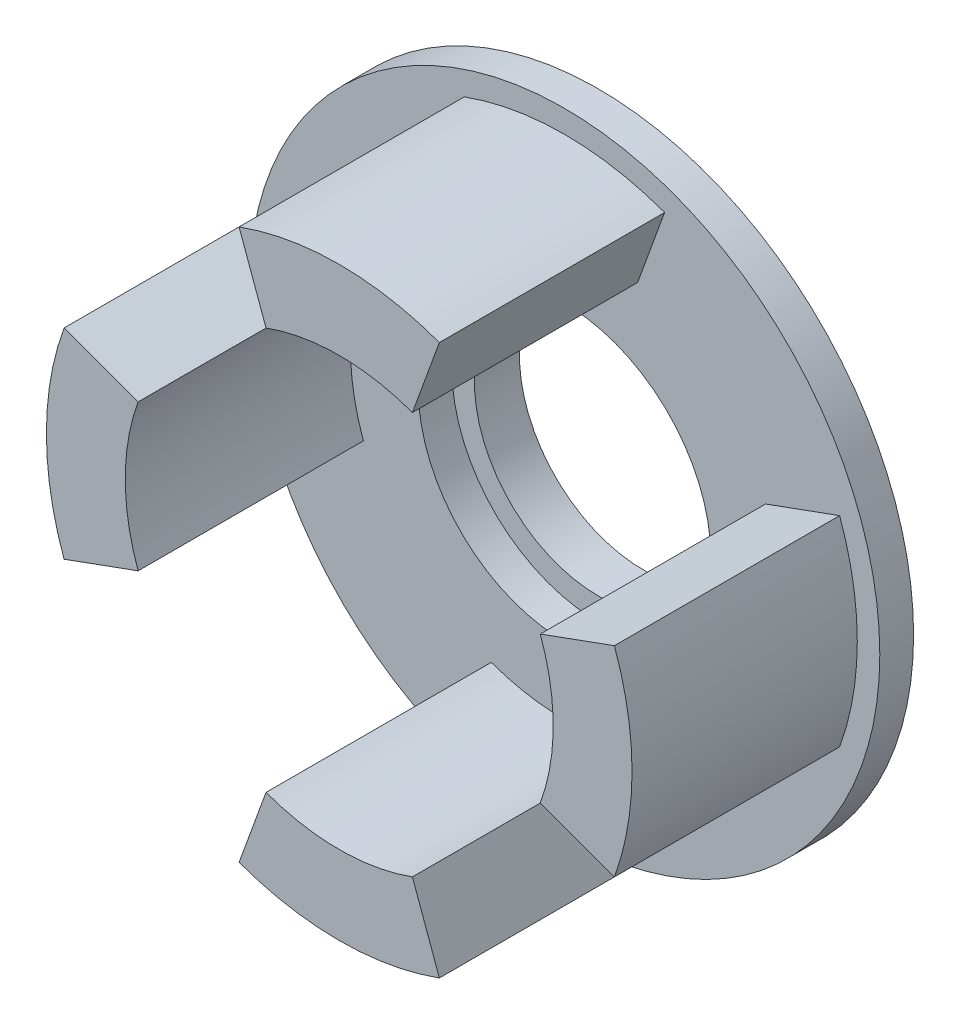
ISO-10303-21;
HEADER;
FILE_DESCRIPTION(('STEP AP214'),'2;1');
FILE_NAME('part.step','',(''),(''),'','','');
FILE_SCHEMA(('AUTOMOTIVE_DESIGN { 1 0 10303 214 1 1 1 1 }'));
ENDSEC;
DATA;
#1=APPLICATION_CONTEXT('core data for automotive mechanical design processes');
#2=APPLICATION_PROTOCOL_DEFINITION('international standard','automotive_design',2000,#1);
#3=PRODUCT_CONTEXT('',#1,'mechanical');
#4=PRODUCT('Part','Part','',(#3));
#5=PRODUCT_RELATED_PRODUCT_CATEGORY('part','',(#4));
#6=PRODUCT_DEFINITION_FORMATION('','',#4);
#7=PRODUCT_DEFINITION_CONTEXT('part definition',#1,'design');
#8=PRODUCT_DEFINITION('design','',#6,#7);
#9=PRODUCT_DEFINITION_SHAPE('','',#8);
#10=(LENGTH_UNIT() NAMED_UNIT(*) SI_UNIT(.MILLI.,.METRE.));
#11=(NAMED_UNIT(*) PLANE_ANGLE_UNIT() SI_UNIT($,.RADIAN.));
#12=(NAMED_UNIT(*) SI_UNIT($,.STERADIAN.) SOLID_ANGLE_UNIT());
#13=UNCERTAINTY_MEASURE_WITH_UNIT(LENGTH_MEASURE(1.E-05),#10,'distance_accuracy_value','');
#14=(GEOMETRIC_REPRESENTATION_CONTEXT(3) GLOBAL_UNCERTAINTY_ASSIGNED_CONTEXT((#13)) GLOBAL_UNIT_ASSIGNED_CONTEXT((#10,
#11,#12)) REPRESENTATION_CONTEXT('',''));
#15=CARTESIAN_POINT('',(0.,0.,0.));
#16=DIRECTION('',(0.,0.,1.));
#17=DIRECTION('',(1.,0.,0.));
#18=AXIS2_PLACEMENT_3D('',#15,#16,#17);
#19=CARTESIAN_POINT('',(0.,0.,7.));
#20=DIRECTION('',(0.,0.,1.));
#21=DIRECTION('',(1.,0.,0.));
#22=AXIS2_PLACEMENT_3D('',#19,#20,#21);
#23=PLANE('',#22);
#24=CARTESIAN_POINT('',(0.,0.,7.));
#25=DIRECTION('',(0.,0.,1.));
#26=DIRECTION('',(1.,0.,0.));
#27=AXIS2_PLACEMENT_3D('',#24,#25,#26);
#28=CIRCLE('',#27,28.);
#29=CARTESIAN_POINT('',(28.,0.,7.));
#30=VERTEX_POINT('',#29);
#31=EDGE_CURVE('E317',#30,#30,#28,.T.);
#32=ORIENTED_EDGE('',*,*,#31,.T.);
#33=EDGE_LOOP('',(#32));
#34=FACE_BOUND('',#33,.T.);
#35=CARTESIAN_POINT('',(0.,0.,7.));
#36=DIRECTION('',(0.,0.,1.));
#37=DIRECTION('',(1.,0.,0.));
#38=AXIS2_PLACEMENT_3D('',#35,#36,#37);
#39=CIRCLE('',#38,13.);
#40=CARTESIAN_POINT('',(13.,0.,7.));
#41=VERTEX_POINT('',#40);
#42=EDGE_CURVE('E309',#41,#41,#39,.T.);
#43=ORIENTED_EDGE('',*,*,#42,.F.);
#44=EDGE_LOOP('',(#43));
#45=FACE_BOUND('',#44,.T.);
#46=DIRECTION('',(0.34202014332567,-0.939692620785908,0.));
#47=VECTOR('',#46,1.);
#48=CARTESIAN_POINT('',(-8.89252372646741,24.4320081404336,7.));
#49=LINE('',#48,#47);
#50=CARTESIAN_POINT('',(-8.89252372646741,24.4320081404336,7.));
#51=VERTEX_POINT('',#50);
#52=CARTESIAN_POINT('',(-6.49838272318772,17.8541597949323,7.));
#53=VERTEX_POINT('',#52);
#54=EDGE_CURVE('E286',#51,#53,#49,.T.);
#55=ORIENTED_EDGE('',*,*,#54,.F.);
#56=CARTESIAN_POINT('',(0.,0.,7.));
#57=DIRECTION('',(0.,0.,1.));
#58=DIRECTION('',(1.,0.,0.));
#59=AXIS2_PLACEMENT_3D('',#56,#57,#58);
#60=CIRCLE('',#59,26.);
#61=CARTESIAN_POINT('',(8.89252372646741,24.4320081404336,7.));
#62=VERTEX_POINT('',#61);
#63=EDGE_CURVE('E267',#62,#51,#60,.T.);
#64=ORIENTED_EDGE('',*,*,#63,.F.);
#65=DIRECTION('',(0.342020143325669,0.939692620785908,0.));
#66=VECTOR('',#65,1.);
#67=CARTESIAN_POINT('',(8.89252372646741,24.4320081404336,7.));
#68=LINE('',#67,#66);
#69=CARTESIAN_POINT('',(6.49838272318772,17.8541597949323,7.));
#70=VERTEX_POINT('',#69);
#71=EDGE_CURVE('E273',#70,#62,#68,.T.);
#72=ORIENTED_EDGE('',*,*,#71,.F.);
#73=CARTESIAN_POINT('',(0.,0.,7.));
#74=DIRECTION('',(0.,0.,-1.));
#75=DIRECTION('',(1.,0.,0.));
#76=AXIS2_PLACEMENT_3D('',#73,#74,#75);
#77=CIRCLE('',#76,19.);
#78=EDGE_CURVE('E289',#53,#70,#77,.T.);
#79=ORIENTED_EDGE('',*,*,#78,.F.);
#80=EDGE_LOOP('',(#55,#64,#72,#79));
#81=FACE_BOUND('',#80,.T.);
#82=DIRECTION('',(-0.939692620785909,-0.342020143325667,0.));
#83=VECTOR('',#82,1.);
#84=CARTESIAN_POINT('',(24.4320081404336,8.89252372646732,7.));
#85=LINE('',#84,#83);
#86=CARTESIAN_POINT('',(24.4320081404336,8.89252372646732,7.));
#87=VERTEX_POINT('',#86);
#88=CARTESIAN_POINT('',(17.8541597949323,6.49838272318766,7.));
#89=VERTEX_POINT('',#88);
#90=EDGE_CURVE('E245',#87,#89,#85,.T.);
#91=ORIENTED_EDGE('',*,*,#90,.F.);
#92=CARTESIAN_POINT('',(0.,0.,7.));
#93=DIRECTION('',(0.,0.,1.));
#94=DIRECTION('',(1.,0.,0.));
#95=AXIS2_PLACEMENT_3D('',#92,#93,#94);
#96=CIRCLE('',#95,26.);
#97=CARTESIAN_POINT('',(24.4320081404336,-8.89252372646749,7.));
#98=VERTEX_POINT('',#97);
#99=EDGE_CURVE('E226',#98,#87,#96,.T.);
#100=ORIENTED_EDGE('',*,*,#99,.F.);
#101=DIRECTION('',(0.939692620785907,-0.342020143325672,0.));
#102=VECTOR('',#101,1.);
#103=CARTESIAN_POINT('',(24.4320081404336,-8.89252372646749,7.));
#104=LINE('',#103,#102);
#105=CARTESIAN_POINT('',(17.8541597949322,-6.49838272318778,7.));
#106=VERTEX_POINT('',#105);
#107=EDGE_CURVE('E232',#106,#98,#104,.T.);
#108=ORIENTED_EDGE('',*,*,#107,.F.);
#109=CARTESIAN_POINT('',(0.,0.,7.));
#110=DIRECTION('',(0.,0.,-1.));
#111=DIRECTION('',(1.,0.,0.));
#112=AXIS2_PLACEMENT_3D('',#109,#110,#111);
#113=CIRCLE('',#112,19.);
#114=EDGE_CURVE('E248',#89,#106,#113,.T.);
#115=ORIENTED_EDGE('',*,*,#114,.F.);
#116=EDGE_LOOP('',(#91,#100,#108,#115));
#117=FACE_BOUND('',#116,.T.);
#118=DIRECTION('',(-0.342020143325663,0.939692620785911,0.));
#119=VECTOR('',#118,1.);
#120=CARTESIAN_POINT('',(8.89252372646724,-24.4320081404337,7.));
#121=LINE('',#120,#119);
#122=CARTESIAN_POINT('',(8.89252372646724,-24.4320081404337,7.));
#123=VERTEX_POINT('',#122);
#124=CARTESIAN_POINT('',(6.49838272318759,-17.8541597949323,7.));
#125=VERTEX_POINT('',#124);
#126=EDGE_CURVE('E187',#123,#125,#121,.T.);
#127=ORIENTED_EDGE('',*,*,#126,.F.);
#128=CARTESIAN_POINT('',(0.,0.,7.));
#129=DIRECTION('',(0.,0.,1.));
#130=DIRECTION('',(1.,0.,0.));
#131=AXIS2_PLACEMENT_3D('',#128,#129,#130);
#132=CIRCLE('',#131,26.);
#133=CARTESIAN_POINT('',(-8.89252372646758,-24.4320081404336,7.));
#134=VERTEX_POINT('',#133);
#135=EDGE_CURVE('E182',#134,#123,#132,.T.);
#136=ORIENTED_EDGE('',*,*,#135,.F.);
#137=DIRECTION('',(-0.342020143325676,-0.939692620785906,0.));
#138=VECTOR('',#137,1.);
#139=CARTESIAN_POINT('',(-8.89252372646758,-24.4320081404336,7.));
#140=LINE('',#139,#138);
#141=CARTESIAN_POINT('',(-6.49838272318785,-17.8541597949322,7.));
#142=VERTEX_POINT('',#141);
#143=EDGE_CURVE('E197',#142,#134,#140,.T.);
#144=ORIENTED_EDGE('',*,*,#143,.F.);
#145=CARTESIAN_POINT('',(0.,0.,7.));
#146=DIRECTION('',(0.,0.,-1.));
#147=DIRECTION('',(1.,0.,0.));
#148=AXIS2_PLACEMENT_3D('',#145,#146,#147);
#149=CIRCLE('',#148,19.);
#150=EDGE_CURVE('E209',#125,#142,#149,.T.);
#151=ORIENTED_EDGE('',*,*,#150,.F.);
#152=EDGE_LOOP('',(#127,#136,#144,#151));
#153=FACE_BOUND('',#152,.T.);
#154=DIRECTION('',(0.939692620785912,0.34202014332566,0.));
#155=VECTOR('',#154,1.);
#156=CARTESIAN_POINT('',(-24.4320081404337,-8.89252372646715,7.));
#157=LINE('',#156,#155);
#158=CARTESIAN_POINT('',(-24.4320081404337,-8.89252372646715,7.));
#159=VERTEX_POINT('',#158);
#160=CARTESIAN_POINT('',(-17.8541597949323,-6.49838272318753,7.));
#161=VERTEX_POINT('',#160);
#162=EDGE_CURVE('E619',#159,#161,#157,.T.);
#163=ORIENTED_EDGE('',*,*,#162,.F.);
#164=CARTESIAN_POINT('',(0.,0.,7.));
#165=DIRECTION('',(0.,0.,1.));
#166=DIRECTION('',(1.,0.,0.));
#167=AXIS2_PLACEMENT_3D('',#164,#165,#166);
#168=CIRCLE('',#167,26.);
#169=CARTESIAN_POINT('',(-24.4320081404335,8.89252372646767,7.));
#170=VERTEX_POINT('',#169);
#171=EDGE_CURVE('E179',#170,#159,#168,.T.);
#172=ORIENTED_EDGE('',*,*,#171,.F.);
#173=DIRECTION('',(-0.939692620785905,0.342020143325679,0.));
#174=VECTOR('',#173,1.);
#175=CARTESIAN_POINT('',(-24.4320081404335,8.89252372646767,7.));
#176=LINE('',#175,#174);
#177=CARTESIAN_POINT('',(-17.8541597949322,6.49838272318791,7.));
#178=VERTEX_POINT('',#177);
#179=EDGE_CURVE('E175',#178,#170,#176,.T.);
#180=ORIENTED_EDGE('',*,*,#179,.F.);
#181=CARTESIAN_POINT('',(0.,0.,7.));
#182=DIRECTION('',(0.,0.,-1.));
#183=DIRECTION('',(1.,0.,0.));
#184=AXIS2_PLACEMENT_3D('',#181,#182,#183);
#185=CIRCLE('',#184,19.);
#186=EDGE_CURVE('E615',#161,#178,#185,.T.);
#187=ORIENTED_EDGE('',*,*,#186,.F.);
#188=EDGE_LOOP('',(#163,#172,#180,#187));
#189=FACE_BOUND('',#188,.T.);
#190=ADVANCED_FACE('F39',(#34,#45,#81,#117,#153,#189),#23,.T.);
#191=CARTESIAN_POINT('',(0.,0.,4.));
#192=DIRECTION('',(0.,0.,1.));
#193=DIRECTION('',(1.,0.,0.));
#194=AXIS2_PLACEMENT_3D('',#191,#192,#193);
#195=PLANE('',#194);
#196=CARTESIAN_POINT('',(0.,0.,4.));
#197=DIRECTION('',(0.,0.,1.));
#198=DIRECTION('',(1.,0.,0.));
#199=AXIS2_PLACEMENT_3D('',#196,#197,#198);
#200=CIRCLE('',#199,11.);
#201=CARTESIAN_POINT('',(11.,0.,4.));
#202=VERTEX_POINT('',#201);
#203=EDGE_CURVE('E325',#202,#202,#200,.T.);
#204=ORIENTED_EDGE('',*,*,#203,.F.);
#205=EDGE_LOOP('',(#204));
#206=FACE_BOUND('',#205,.T.);
#207=CARTESIAN_POINT('',(0.,0.,4.));
#208=DIRECTION('',(0.,0.,1.));
#209=DIRECTION('',(1.,0.,0.));
#210=AXIS2_PLACEMENT_3D('',#207,#208,#209);
#211=CIRCLE('',#210,13.);
#212=CARTESIAN_POINT('',(13.,0.,4.));
#213=VERTEX_POINT('',#212);
#214=EDGE_CURVE('E308',#213,#213,#211,.T.);
#215=ORIENTED_EDGE('',*,*,#214,.T.);
#216=EDGE_LOOP('',(#215));
#217=FACE_BOUND('',#216,.T.);
#218=ADVANCED_FACE('F351',(#206,#217),#195,.T.);
#219=CARTESIAN_POINT('',(0.,0.,0.));
#220=DIRECTION('',(0.,0.,1.));
#221=DIRECTION('',(1.,0.,0.));
#222=AXIS2_PLACEMENT_3D('',#219,#220,#221);
#223=PLANE('',#222);
#224=CARTESIAN_POINT('',(0.,0.,0.));
#225=DIRECTION('',(0.,0.,1.));
#226=DIRECTION('',(1.,0.,0.));
#227=AXIS2_PLACEMENT_3D('',#224,#225,#226);
#228=CIRCLE('',#227,16.);
#229=CARTESIAN_POINT('',(16.,0.,0.));
#230=VERTEX_POINT('',#229);
#231=EDGE_CURVE('E43',#230,#230,#228,.T.);
#232=ORIENTED_EDGE('',*,*,#231,.F.);
#233=EDGE_LOOP('',(#232));
#234=FACE_BOUND('',#233,.T.);
#235=CARTESIAN_POINT('',(0.,0.,0.));
#236=DIRECTION('',(0.,0.,1.));
#237=DIRECTION('',(1.,0.,0.));
#238=AXIS2_PLACEMENT_3D('',#235,#236,#237);
#239=CIRCLE('',#238,11.);
#240=CARTESIAN_POINT('',(11.,0.,0.));
#241=VERTEX_POINT('',#240);
#242=EDGE_CURVE('E321',#241,#241,#239,.T.);
#243=ORIENTED_EDGE('',*,*,#242,.T.);
#244=EDGE_LOOP('',(#243));
#245=FACE_BOUND('',#244,.T.);
#246=ADVANCED_FACE('F333',(#234,#245),#223,.F.);
#247=CARTESIAN_POINT('',(0.,0.,4.));
#248=DIRECTION('',(0.,0.,-1.));
#249=DIRECTION('',(-1.,0.,0.));
#250=AXIS2_PLACEMENT_3D('',#247,#248,#249);
#251=CYLINDRICAL_SURFACE('',#250,16.);
#252=CARTESIAN_POINT('',(0.,0.,4.));
#253=DIRECTION('',(0.,0.,1.));
#254=DIRECTION('',(1.,0.,0.));
#255=AXIS2_PLACEMENT_3D('',#252,#253,#254);
#256=CIRCLE('',#255,16.);
#257=CARTESIAN_POINT('',(16.,0.,4.));
#258=VERTEX_POINT('',#257);
#259=EDGE_CURVE('E11',#258,#258,#256,.T.);
#260=ORIENTED_EDGE('',*,*,#259,.F.);
#261=EDGE_LOOP('',(#260));
#262=FACE_BOUND('',#261,.T.);
#263=ORIENTED_EDGE('',*,*,#231,.T.);
#264=EDGE_LOOP('',(#263));
#265=FACE_BOUND('',#264,.T.);
#266=ADVANCED_FACE('F41',(#262,#265),#251,.T.);
#267=CARTESIAN_POINT('',(0.,0.,4.));
#268=DIRECTION('',(0.,0.,-1.));
#269=DIRECTION('',(-1.,0.,0.));
#270=AXIS2_PLACEMENT_3D('',#267,#268,#269);
#271=CYLINDRICAL_SURFACE('',#270,11.);
#272=ORIENTED_EDGE('',*,*,#203,.T.);
#273=EDGE_LOOP('',(#272));
#274=FACE_BOUND('',#273,.T.);
#275=ORIENTED_EDGE('',*,*,#242,.F.);
#276=EDGE_LOOP('',(#275));
#277=FACE_BOUND('',#276,.T.);
#278=ADVANCED_FACE('F335',(#274,#277),#271,.F.);
#279=CARTESIAN_POINT('',(0.,0.,4.));
#280=DIRECTION('',(0.,0.,1.));
#281=DIRECTION('',(1.,0.,0.));
#282=AXIS2_PLACEMENT_3D('',#279,#280,#281);
#283=PLANE('',#282);
#284=CARTESIAN_POINT('',(0.,0.,4.));
#285=DIRECTION('',(0.,0.,1.));
#286=DIRECTION('',(1.,0.,0.));
#287=AXIS2_PLACEMENT_3D('',#284,#285,#286);
#288=CIRCLE('',#287,28.);
#289=CARTESIAN_POINT('',(28.,0.,4.));
#290=VERTEX_POINT('',#289);
#291=EDGE_CURVE('E313',#290,#290,#288,.T.);
#292=ORIENTED_EDGE('',*,*,#291,.F.);
#293=EDGE_LOOP('',(#292));
#294=FACE_BOUND('',#293,.T.);
#295=ORIENTED_EDGE('',*,*,#259,.T.);
#296=EDGE_LOOP('',(#295));
#297=FACE_BOUND('',#296,.T.);
#298=ADVANCED_FACE('F337',(#294,#297),#283,.F.);
#299=CARTESIAN_POINT('',(0.,0.,7.));
#300=DIRECTION('',(0.,0.,-1.));
#301=DIRECTION('',(-1.,0.,0.));
#302=AXIS2_PLACEMENT_3D('',#299,#300,#301);
#303=CYLINDRICAL_SURFACE('',#302,28.);
#304=ORIENTED_EDGE('',*,*,#31,.F.);
#305=EDGE_LOOP('',(#304));
#306=FACE_BOUND('',#305,.T.);
#307=ORIENTED_EDGE('',*,*,#291,.T.);
#308=EDGE_LOOP('',(#307));
#309=FACE_BOUND('',#308,.T.);
#310=ADVANCED_FACE('F344',(#306,#309),#303,.T.);
#311=CARTESIAN_POINT('',(0.,0.,7.));
#312=DIRECTION('',(0.,0.,-1.));
#313=DIRECTION('',(-1.,0.,0.));
#314=AXIS2_PLACEMENT_3D('',#311,#312,#313);
#315=CYLINDRICAL_SURFACE('',#314,13.);
#316=ORIENTED_EDGE('',*,*,#42,.T.);
#317=EDGE_LOOP('',(#316));
#318=FACE_BOUND('',#317,.T.);
#319=ORIENTED_EDGE('',*,*,#214,.F.);
#320=EDGE_LOOP('',(#319));
#321=FACE_BOUND('',#320,.T.);
#322=ADVANCED_FACE('F360',(#318,#321),#315,.F.);
#323=CARTESIAN_POINT('',(0.,0.,27.));
#324=DIRECTION('',(0.,0.,-1.));
#325=DIRECTION('',(-1.,0.,0.));
#326=AXIS2_PLACEMENT_3D('',#323,#324,#325);
#327=CYLINDRICAL_SURFACE('',#326,26.);
#328=ORIENTED_EDGE('',*,*,#63,.T.);
#329=DIRECTION('',(0.,0.,-1.));
#330=VECTOR('',#329,1.);
#331=CARTESIAN_POINT('',(-8.89252372646741,24.4320081404336,27.));
#332=LINE('',#331,#330);
#333=CARTESIAN_POINT('',(-8.89252372646741,24.4320081404336,27.));
#334=VERTEX_POINT('',#333);
#335=EDGE_CURVE('E305',#334,#51,#332,.T.);
#336=ORIENTED_EDGE('',*,*,#335,.F.);
#337=CARTESIAN_POINT('',(0.,0.,27.));
#338=DIRECTION('',(0.,0.,1.));
#339=DIRECTION('',(1.,0.,0.));
#340=AXIS2_PLACEMENT_3D('',#337,#338,#339);
#341=CIRCLE('',#340,26.);
#342=CARTESIAN_POINT('',(8.89252372646741,24.4320081404336,27.));
#343=VERTEX_POINT('',#342);
#344=EDGE_CURVE('E268',#343,#334,#341,.T.);
#345=ORIENTED_EDGE('',*,*,#344,.F.);
#346=DIRECTION('',(0.,0.,-1.));
#347=VECTOR('',#346,1.);
#348=CARTESIAN_POINT('',(8.89252372646741,24.4320081404336,27.));
#349=LINE('',#348,#347);
#350=EDGE_CURVE('E282',#343,#62,#349,.T.);
#351=ORIENTED_EDGE('',*,*,#350,.T.);
#352=EDGE_LOOP('',(#328,#336,#345,#351));
#353=FACE_BOUND('',#352,.T.);
#354=ADVANCED_FACE('F367',(#353),#327,.T.);
#355=CARTESIAN_POINT('',(-8.89252372646741,24.4320081404336,27.));
#356=DIRECTION('',(0.939692620785908,0.34202014332567,0.));
#357=DIRECTION('',(-0.34202014332567,0.939692620785908,0.));
#358=AXIS2_PLACEMENT_3D('',#355,#356,#357);
#359=PLANE('',#358);
#360=ORIENTED_EDGE('',*,*,#54,.T.);
#361=DIRECTION('',(0.,0.,-1.));
#362=VECTOR('',#361,1.);
#363=CARTESIAN_POINT('',(-6.49838272318772,17.8541597949323,27.));
#364=LINE('',#363,#362);
#365=CARTESIAN_POINT('',(-6.49838272318772,17.8541597949323,27.));
#366=VERTEX_POINT('',#365);
#367=EDGE_CURVE('E301',#366,#53,#364,.T.);
#368=ORIENTED_EDGE('',*,*,#367,.F.);
#369=DIRECTION('',(0.34202014332567,-0.939692620785908,0.));
#370=VECTOR('',#369,1.);
#371=CARTESIAN_POINT('',(-8.89252372646741,24.4320081404336,27.));
#372=LINE('',#371,#370);
#373=EDGE_CURVE('E272',#334,#366,#372,.T.);
#374=ORIENTED_EDGE('',*,*,#373,.F.);
#375=ORIENTED_EDGE('',*,*,#335,.T.);
#376=EDGE_LOOP('',(#360,#368,#374,#375));
#377=FACE_BOUND('',#376,.T.);
#378=ADVANCED_FACE('F425',(#377),#359,.F.);
#379=CARTESIAN_POINT('',(0.,0.,27.));
#380=DIRECTION('',(0.,0.,-1.));
#381=DIRECTION('',(-1.,0.,0.));
#382=AXIS2_PLACEMENT_3D('',#379,#380,#381);
#383=CYLINDRICAL_SURFACE('',#382,19.);
#384=ORIENTED_EDGE('',*,*,#78,.T.);
#385=DIRECTION('',(0.,0.,-1.));
#386=VECTOR('',#385,1.);
#387=CARTESIAN_POINT('',(6.49838272318772,17.8541597949323,27.));
#388=LINE('',#387,#386);
#389=CARTESIAN_POINT('',(6.49838272318772,17.8541597949323,27.));
#390=VERTEX_POINT('',#389);
#391=EDGE_CURVE('E298',#390,#70,#388,.T.);
#392=ORIENTED_EDGE('',*,*,#391,.F.);
#393=CARTESIAN_POINT('',(0.,0.,27.));
#394=DIRECTION('',(0.,0.,-1.));
#395=DIRECTION('',(1.,0.,0.));
#396=AXIS2_PLACEMENT_3D('',#393,#394,#395);
#397=CIRCLE('',#396,19.);
#398=EDGE_CURVE('E276',#366,#390,#397,.T.);
#399=ORIENTED_EDGE('',*,*,#398,.F.);
#400=ORIENTED_EDGE('',*,*,#367,.T.);
#401=EDGE_LOOP('',(#384,#392,#399,#400));
#402=FACE_BOUND('',#401,.T.);
#403=ADVANCED_FACE('F434',(#402),#383,.F.);
#404=CARTESIAN_POINT('',(8.89252372646741,24.4320081404336,27.));
#405=DIRECTION('',(-0.939692620785908,0.342020143325669,0.));
#406=DIRECTION('',(-0.342020143325669,-0.939692620785908,0.));
#407=AXIS2_PLACEMENT_3D('',#404,#405,#406);
#408=PLANE('',#407);
#409=ORIENTED_EDGE('',*,*,#71,.T.);
#410=ORIENTED_EDGE('',*,*,#350,.F.);
#411=DIRECTION('',(0.342020143325669,0.939692620785908,0.));
#412=VECTOR('',#411,1.);
#413=CARTESIAN_POINT('',(8.89252372646741,24.4320081404336,27.));
#414=LINE('',#413,#412);
#415=EDGE_CURVE('E279',#390,#343,#414,.T.);
#416=ORIENTED_EDGE('',*,*,#415,.F.);
#417=ORIENTED_EDGE('',*,*,#391,.T.);
#418=EDGE_LOOP('',(#409,#410,#416,#417));
#419=FACE_BOUND('',#418,.T.);
#420=ADVANCED_FACE('F444',(#419),#408,.F.);
#421=CARTESIAN_POINT('',(0.,0.,27.));
#422=DIRECTION('',(0.,0.,1.));
#423=DIRECTION('',(1.,0.,0.));
#424=AXIS2_PLACEMENT_3D('',#421,#422,#423);
#425=PLANE('',#424);
#426=ORIENTED_EDGE('',*,*,#344,.T.);
#427=ORIENTED_EDGE('',*,*,#373,.T.);
#428=ORIENTED_EDGE('',*,*,#398,.T.);
#429=ORIENTED_EDGE('',*,*,#415,.T.);
#430=EDGE_LOOP('',(#426,#427,#428,#429));
#431=FACE_BOUND('',#430,.T.);
#432=ADVANCED_FACE('F454',(#431),#425,.T.);
#433=CARTESIAN_POINT('',(0.,0.,27.));
#434=DIRECTION('',(0.,0.,-1.));
#435=DIRECTION('',(-1.,0.,0.));
#436=AXIS2_PLACEMENT_3D('',#433,#434,#435);
#437=CYLINDRICAL_SURFACE('',#436,26.);
#438=ORIENTED_EDGE('',*,*,#99,.T.);
#439=DIRECTION('',(0.,0.,-1.));
#440=VECTOR('',#439,1.);
#441=CARTESIAN_POINT('',(24.4320081404336,8.89252372646732,27.));
#442=LINE('',#441,#440);
#443=CARTESIAN_POINT('',(24.4320081404336,8.89252372646732,27.));
#444=VERTEX_POINT('',#443);
#445=EDGE_CURVE('E264',#444,#87,#442,.T.);
#446=ORIENTED_EDGE('',*,*,#445,.F.);
#447=CARTESIAN_POINT('',(0.,0.,27.));
#448=DIRECTION('',(0.,0.,1.));
#449=DIRECTION('',(1.,0.,0.));
#450=AXIS2_PLACEMENT_3D('',#447,#448,#449);
#451=CIRCLE('',#450,26.);
#452=CARTESIAN_POINT('',(24.4320081404336,-8.89252372646749,27.));
#453=VERTEX_POINT('',#452);
#454=EDGE_CURVE('E227',#453,#444,#451,.T.);
#455=ORIENTED_EDGE('',*,*,#454,.F.);
#456=DIRECTION('',(0.,0.,-1.));
#457=VECTOR('',#456,1.);
#458=CARTESIAN_POINT('',(24.4320081404336,-8.89252372646749,27.));
#459=LINE('',#458,#457);
#460=EDGE_CURVE('E241',#453,#98,#459,.T.);
#461=ORIENTED_EDGE('',*,*,#460,.T.);
#462=EDGE_LOOP('',(#438,#446,#455,#461));
#463=FACE_BOUND('',#462,.T.);
#464=ADVANCED_FACE('F464',(#463),#437,.T.);
#465=CARTESIAN_POINT('',(24.4320081404336,8.89252372646732,27.));
#466=DIRECTION('',(0.342020143325667,-0.939692620785909,0.));
#467=DIRECTION('',(0.939692620785909,0.342020143325667,0.));
#468=AXIS2_PLACEMENT_3D('',#465,#466,#467);
#469=PLANE('',#468);
#470=ORIENTED_EDGE('',*,*,#90,.T.);
#471=DIRECTION('',(0.,0.,-1.));
#472=VECTOR('',#471,1.);
#473=CARTESIAN_POINT('',(17.8541597949323,6.49838272318766,27.));
#474=LINE('',#473,#472);
#475=CARTESIAN_POINT('',(17.8541597949323,6.49838272318766,27.));
#476=VERTEX_POINT('',#475);
#477=EDGE_CURVE('E260',#476,#89,#474,.T.);
#478=ORIENTED_EDGE('',*,*,#477,.F.);
#479=DIRECTION('',(-0.939692620785909,-0.342020143325667,0.));
#480=VECTOR('',#479,1.);
#481=CARTESIAN_POINT('',(24.4320081404336,8.89252372646732,27.));
#482=LINE('',#481,#480);
#483=EDGE_CURVE('E231',#444,#476,#482,.T.);
#484=ORIENTED_EDGE('',*,*,#483,.F.);
#485=ORIENTED_EDGE('',*,*,#445,.T.);
#486=EDGE_LOOP('',(#470,#478,#484,#485));
#487=FACE_BOUND('',#486,.T.);
#488=ADVANCED_FACE('F474',(#487),#469,.F.);
#489=CARTESIAN_POINT('',(0.,0.,27.));
#490=DIRECTION('',(0.,0.,-1.));
#491=DIRECTION('',(-1.,0.,0.));
#492=AXIS2_PLACEMENT_3D('',#489,#490,#491);
#493=CYLINDRICAL_SURFACE('',#492,19.);
#494=ORIENTED_EDGE('',*,*,#114,.T.);
#495=DIRECTION('',(0.,0.,-1.));
#496=VECTOR('',#495,1.);
#497=CARTESIAN_POINT('',(17.8541597949322,-6.49838272318778,27.));
#498=LINE('',#497,#496);
#499=CARTESIAN_POINT('',(17.8541597949322,-6.49838272318778,27.));
#500=VERTEX_POINT('',#499);
#501=EDGE_CURVE('E257',#500,#106,#498,.T.);
#502=ORIENTED_EDGE('',*,*,#501,.F.);
#503=CARTESIAN_POINT('',(0.,0.,27.));
#504=DIRECTION('',(0.,0.,-1.));
#505=DIRECTION('',(1.,0.,0.));
#506=AXIS2_PLACEMENT_3D('',#503,#504,#505);
#507=CIRCLE('',#506,19.);
#508=EDGE_CURVE('E235',#476,#500,#507,.T.);
#509=ORIENTED_EDGE('',*,*,#508,.F.);
#510=ORIENTED_EDGE('',*,*,#477,.T.);
#511=EDGE_LOOP('',(#494,#502,#509,#510));
#512=FACE_BOUND('',#511,.T.);
#513=ADVANCED_FACE('F484',(#512),#493,.F.);
#514=CARTESIAN_POINT('',(24.4320081404336,-8.89252372646749,27.));
#515=DIRECTION('',(0.342020143325672,0.939692620785907,0.));
#516=DIRECTION('',(-0.939692620785907,0.342020143325672,0.));
#517=AXIS2_PLACEMENT_3D('',#514,#515,#516);
#518=PLANE('',#517);
#519=ORIENTED_EDGE('',*,*,#107,.T.);
#520=ORIENTED_EDGE('',*,*,#460,.F.);
#521=DIRECTION('',(0.939692620785907,-0.342020143325672,0.));
#522=VECTOR('',#521,1.);
#523=CARTESIAN_POINT('',(24.4320081404336,-8.89252372646749,27.));
#524=LINE('',#523,#522);
#525=EDGE_CURVE('E238',#500,#453,#524,.T.);
#526=ORIENTED_EDGE('',*,*,#525,.F.);
#527=ORIENTED_EDGE('',*,*,#501,.T.);
#528=EDGE_LOOP('',(#519,#520,#526,#527));
#529=FACE_BOUND('',#528,.T.);
#530=ADVANCED_FACE('F494',(#529),#518,.F.);
#531=CARTESIAN_POINT('',(0.,0.,27.));
#532=DIRECTION('',(0.,0.,1.));
#533=DIRECTION('',(1.,0.,0.));
#534=AXIS2_PLACEMENT_3D('',#531,#532,#533);
#535=PLANE('',#534);
#536=ORIENTED_EDGE('',*,*,#454,.T.);
#537=ORIENTED_EDGE('',*,*,#483,.T.);
#538=ORIENTED_EDGE('',*,*,#508,.T.);
#539=ORIENTED_EDGE('',*,*,#525,.T.);
#540=EDGE_LOOP('',(#536,#537,#538,#539));
#541=FACE_BOUND('',#540,.T.);
#542=ADVANCED_FACE('F504',(#541),#535,.T.);
#543=CARTESIAN_POINT('',(0.,0.,27.));
#544=DIRECTION('',(0.,0.,-1.));
#545=DIRECTION('',(-1.,0.,0.));
#546=AXIS2_PLACEMENT_3D('',#543,#544,#545);
#547=CYLINDRICAL_SURFACE('',#546,26.);
#548=ORIENTED_EDGE('',*,*,#135,.T.);
#549=DIRECTION('',(0.,0.,-1.));
#550=VECTOR('',#549,1.);
#551=CARTESIAN_POINT('',(8.89252372646724,-24.4320081404337,27.));
#552=LINE('',#551,#550);
#553=CARTESIAN_POINT('',(8.89252372646724,-24.4320081404337,27.));
#554=VERTEX_POINT('',#553);
#555=EDGE_CURVE('E223',#554,#123,#552,.T.);
#556=ORIENTED_EDGE('',*,*,#555,.F.);
#557=CARTESIAN_POINT('',(0.,0.,27.));
#558=DIRECTION('',(0.,0.,1.));
#559=DIRECTION('',(1.,0.,0.));
#560=AXIS2_PLACEMENT_3D('',#557,#558,#559);
#561=CIRCLE('',#560,26.);
#562=CARTESIAN_POINT('',(-8.89252372646758,-24.4320081404336,27.));
#563=VERTEX_POINT('',#562);
#564=EDGE_CURVE('E192',#563,#554,#561,.T.);
#565=ORIENTED_EDGE('',*,*,#564,.F.);
#566=DIRECTION('',(0.,0.,-1.));
#567=VECTOR('',#566,1.);
#568=CARTESIAN_POINT('',(-8.89252372646758,-24.4320081404336,27.));
#569=LINE('',#568,#567);
#570=EDGE_CURVE('E205',#563,#134,#569,.T.);
#571=ORIENTED_EDGE('',*,*,#570,.T.);
#572=EDGE_LOOP('',(#548,#556,#565,#571));
#573=FACE_BOUND('',#572,.T.);
#574=ADVANCED_FACE('F514',(#573),#547,.T.);
#575=CARTESIAN_POINT('',(8.89252372646724,-24.4320081404337,27.));
#576=DIRECTION('',(-0.93969262078591,-0.342020143325663,0.));
#577=DIRECTION('',(0.342020143325663,-0.93969262078591,0.));
#578=AXIS2_PLACEMENT_3D('',#575,#576,#577);
#579=PLANE('',#578);
#580=ORIENTED_EDGE('',*,*,#126,.T.);
#581=DIRECTION('',(0.,0.,-1.));
#582=VECTOR('',#581,1.);
#583=CARTESIAN_POINT('',(6.49838272318759,-17.8541597949323,27.));
#584=LINE('',#583,#582);
#585=CARTESIAN_POINT('',(6.49838272318759,-17.8541597949323,27.));
#586=VERTEX_POINT('',#585);
#587=EDGE_CURVE('E219',#586,#125,#584,.T.);
#588=ORIENTED_EDGE('',*,*,#587,.F.);
#589=DIRECTION('',(-0.342020143325663,0.939692620785911,0.));
#590=VECTOR('',#589,1.);
#591=CARTESIAN_POINT('',(8.89252372646724,-24.4320081404337,27.));
#592=LINE('',#591,#590);
#593=EDGE_CURVE('E196',#554,#586,#592,.T.);
#594=ORIENTED_EDGE('',*,*,#593,.F.);
#595=ORIENTED_EDGE('',*,*,#555,.T.);
#596=EDGE_LOOP('',(#580,#588,#594,#595));
#597=FACE_BOUND('',#596,.T.);
#598=ADVANCED_FACE('F524',(#597),#579,.F.);
#599=CARTESIAN_POINT('',(0.,0.,27.));
#600=DIRECTION('',(0.,0.,-1.));
#601=DIRECTION('',(-1.,0.,0.));
#602=AXIS2_PLACEMENT_3D('',#599,#600,#601);
#603=CYLINDRICAL_SURFACE('',#602,19.);
#604=ORIENTED_EDGE('',*,*,#150,.T.);
#605=DIRECTION('',(0.,0.,-1.));
#606=VECTOR('',#605,1.);
#607=CARTESIAN_POINT('',(-6.49838272318785,-17.8541597949322,27.));
#608=LINE('',#607,#606);
#609=CARTESIAN_POINT('',(-6.49838272318785,-17.8541597949322,27.));
#610=VERTEX_POINT('',#609);
#611=EDGE_CURVE('E63',#610,#142,#608,.T.);
#612=ORIENTED_EDGE('',*,*,#611,.F.);
#613=CARTESIAN_POINT('',(0.,0.,27.));
#614=DIRECTION('',(0.,0.,-1.));
#615=DIRECTION('',(1.,0.,0.));
#616=AXIS2_PLACEMENT_3D('',#613,#614,#615);
#617=CIRCLE('',#616,19.);
#618=EDGE_CURVE('E200',#586,#610,#617,.T.);
#619=ORIENTED_EDGE('',*,*,#618,.F.);
#620=ORIENTED_EDGE('',*,*,#587,.T.);
#621=EDGE_LOOP('',(#604,#612,#619,#620));
#622=FACE_BOUND('',#621,.T.);
#623=ADVANCED_FACE('F534',(#622),#603,.F.);
#624=CARTESIAN_POINT('',(-8.89252372646758,-24.4320081404336,27.));
#625=DIRECTION('',(0.939692620785906,-0.342020143325676,0.));
#626=DIRECTION('',(0.342020143325676,0.939692620785906,0.));
#627=AXIS2_PLACEMENT_3D('',#624,#625,#626);
#628=PLANE('',#627);
#629=ORIENTED_EDGE('',*,*,#143,.T.);
#630=ORIENTED_EDGE('',*,*,#570,.F.);
#631=DIRECTION('',(-0.342020143325676,-0.939692620785906,0.));
#632=VECTOR('',#631,1.);
#633=CARTESIAN_POINT('',(-8.89252372646758,-24.4320081404336,27.));
#634=LINE('',#633,#632);
#635=EDGE_CURVE('E203',#610,#563,#634,.T.);
#636=ORIENTED_EDGE('',*,*,#635,.F.);
#637=ORIENTED_EDGE('',*,*,#611,.T.);
#638=EDGE_LOOP('',(#629,#630,#636,#637));
#639=FACE_BOUND('',#638,.T.);
#640=ADVANCED_FACE('F544',(#639),#628,.F.);
#641=CARTESIAN_POINT('',(0.,0.,27.));
#642=DIRECTION('',(0.,0.,1.));
#643=DIRECTION('',(1.,0.,0.));
#644=AXIS2_PLACEMENT_3D('',#641,#642,#643);
#645=PLANE('',#644);
#646=ORIENTED_EDGE('',*,*,#564,.T.);
#647=ORIENTED_EDGE('',*,*,#593,.T.);
#648=ORIENTED_EDGE('',*,*,#618,.T.);
#649=ORIENTED_EDGE('',*,*,#635,.T.);
#650=EDGE_LOOP('',(#646,#647,#648,#649));
#651=FACE_BOUND('',#650,.T.);
#652=ADVANCED_FACE('F554',(#651),#645,.T.);
#653=CARTESIAN_POINT('',(0.,0.,27.));
#654=DIRECTION('',(0.,0.,-1.));
#655=DIRECTION('',(-1.,0.,0.));
#656=AXIS2_PLACEMENT_3D('',#653,#654,#655);
#657=CYLINDRICAL_SURFACE('',#656,26.);
#658=ORIENTED_EDGE('',*,*,#171,.T.);
#659=DIRECTION('',(0.,0.,-1.));
#660=VECTOR('',#659,1.);
#661=CARTESIAN_POINT('',(-24.4320081404337,-8.89252372646715,27.));
#662=LINE('',#661,#660);
#663=CARTESIAN_POINT('',(-24.4320081404337,-8.89252372646715,27.));
#664=VERTEX_POINT('',#663);
#665=EDGE_CURVE('E158',#664,#159,#662,.T.);
#666=ORIENTED_EDGE('',*,*,#665,.F.);
#667=CARTESIAN_POINT('',(0.,0.,27.));
#668=DIRECTION('',(0.,0.,1.));
#669=DIRECTION('',(1.,0.,0.));
#670=AXIS2_PLACEMENT_3D('',#667,#668,#669);
#671=CIRCLE('',#670,26.);
#672=CARTESIAN_POINT('',(-24.4320081404335,8.89252372646767,27.));
#673=VERTEX_POINT('',#672);
#674=EDGE_CURVE('E166',#673,#664,#671,.T.);
#675=ORIENTED_EDGE('',*,*,#674,.F.);
#676=DIRECTION('',(0.,0.,-1.));
#677=VECTOR('',#676,1.);
#678=CARTESIAN_POINT('',(-24.4320081404335,8.89252372646767,27.));
#679=LINE('',#678,#677);
#680=EDGE_CURVE('E611',#673,#170,#679,.T.);
#681=ORIENTED_EDGE('',*,*,#680,.T.);
#682=EDGE_LOOP('',(#658,#666,#675,#681));
#683=FACE_BOUND('',#682,.T.);
#684=ADVANCED_FACE('F177',(#683),#657,.T.);
#685=CARTESIAN_POINT('',(-24.4320081404337,-8.89252372646715,27.));
#686=DIRECTION('',(-0.34202014332566,0.939692620785912,0.));
#687=DIRECTION('',(-0.939692620785912,-0.34202014332566,0.));
#688=AXIS2_PLACEMENT_3D('',#685,#686,#687);
#689=PLANE('',#688);
#690=ORIENTED_EDGE('',*,*,#162,.T.);
#691=DIRECTION('',(0.,0.,-1.));
#692=VECTOR('',#691,1.);
#693=CARTESIAN_POINT('',(-17.8541597949323,-6.49838272318753,27.));
#694=LINE('',#693,#692);
#695=CARTESIAN_POINT('',(-17.8541597949323,-6.49838272318753,27.));
#696=VERTEX_POINT('',#695);
#697=EDGE_CURVE('E161',#696,#161,#694,.T.);
#698=ORIENTED_EDGE('',*,*,#697,.F.);
#699=DIRECTION('',(0.939692620785912,0.34202014332566,0.));
#700=VECTOR('',#699,1.);
#701=CARTESIAN_POINT('',(-24.4320081404337,-8.89252372646715,27.));
#702=LINE('',#701,#700);
#703=EDGE_CURVE('E154',#664,#696,#702,.T.);
#704=ORIENTED_EDGE('',*,*,#703,.F.);
#705=ORIENTED_EDGE('',*,*,#665,.T.);
#706=EDGE_LOOP('',(#690,#698,#704,#705));
#707=FACE_BOUND('',#706,.T.);
#708=ADVANCED_FACE('F156',(#707),#689,.F.);
#709=CARTESIAN_POINT('',(0.,0.,27.));
#710=DIRECTION('',(0.,0.,-1.));
#711=DIRECTION('',(-1.,0.,0.));
#712=AXIS2_PLACEMENT_3D('',#709,#710,#711);
#713=CYLINDRICAL_SURFACE('',#712,19.);
#714=ORIENTED_EDGE('',*,*,#186,.T.);
#715=DIRECTION('',(0.,0.,-1.));
#716=VECTOR('',#715,1.);
#717=CARTESIAN_POINT('',(-17.8541597949322,6.49838272318791,27.));
#718=LINE('',#717,#716);
#719=CARTESIAN_POINT('',(-17.8541597949322,6.49838272318791,27.));
#720=VERTEX_POINT('',#719);
#721=EDGE_CURVE('E55',#720,#178,#718,.T.);
#722=ORIENTED_EDGE('',*,*,#721,.F.);
#723=CARTESIAN_POINT('',(0.,0.,27.));
#724=DIRECTION('',(0.,0.,-1.));
#725=DIRECTION('',(1.,0.,0.));
#726=AXIS2_PLACEMENT_3D('',#723,#724,#725);
#727=CIRCLE('',#726,19.);
#728=EDGE_CURVE('E165',#696,#720,#727,.T.);
#729=ORIENTED_EDGE('',*,*,#728,.F.);
#730=ORIENTED_EDGE('',*,*,#697,.T.);
#731=EDGE_LOOP('',(#714,#722,#729,#730));
#732=FACE_BOUND('',#731,.T.);
#733=ADVANCED_FACE('F580',(#732),#713,.F.);
#734=CARTESIAN_POINT('',(-24.4320081404335,8.89252372646767,27.));
#735=DIRECTION('',(-0.342020143325679,-0.939692620785905,0.));
#736=DIRECTION('',(0.939692620785905,-0.342020143325679,0.));
#737=AXIS2_PLACEMENT_3D('',#734,#735,#736);
#738=PLANE('',#737);
#739=ORIENTED_EDGE('',*,*,#179,.T.);
#740=ORIENTED_EDGE('',*,*,#680,.F.);
#741=DIRECTION('',(-0.939692620785905,0.342020143325679,0.));
#742=VECTOR('',#741,1.);
#743=CARTESIAN_POINT('',(-24.4320081404335,8.89252372646767,27.));
#744=LINE('',#743,#742);
#745=EDGE_CURVE('E170',#720,#673,#744,.T.);
#746=ORIENTED_EDGE('',*,*,#745,.F.);
#747=ORIENTED_EDGE('',*,*,#721,.T.);
#748=EDGE_LOOP('',(#739,#740,#746,#747));
#749=FACE_BOUND('',#748,.T.);
#750=ADVANCED_FACE('F589',(#749),#738,.F.);
#751=CARTESIAN_POINT('',(0.,0.,27.));
#752=DIRECTION('',(0.,0.,1.));
#753=DIRECTION('',(1.,0.,0.));
#754=AXIS2_PLACEMENT_3D('',#751,#752,#753);
#755=PLANE('',#754);
#756=ORIENTED_EDGE('',*,*,#674,.T.);
#757=ORIENTED_EDGE('',*,*,#703,.T.);
#758=ORIENTED_EDGE('',*,*,#728,.T.);
#759=ORIENTED_EDGE('',*,*,#745,.T.);
#760=EDGE_LOOP('',(#756,#757,#758,#759));
#761=FACE_BOUND('',#760,.T.);
#762=ADVANCED_FACE('F169',(#761),#755,.T.);
#763=CLOSED_SHELL('',(#190,#218,#246,#266,#278,#298,#310,#322,#354,#378,#403,#420,#432,#464,
#488,#513,#530,#542,#574,#598,#623,#640,#652,#684,#708,#733,#750,#762));
#764=MANIFOLD_SOLID_BREP('B2',#763);
#765=ADVANCED_BREP_SHAPE_REPRESENTATION('',(#18,#764),#14);
#766=SHAPE_DEFINITION_REPRESENTATION(#9,#765);
ENDSEC;
END-ISO-10303-21;
